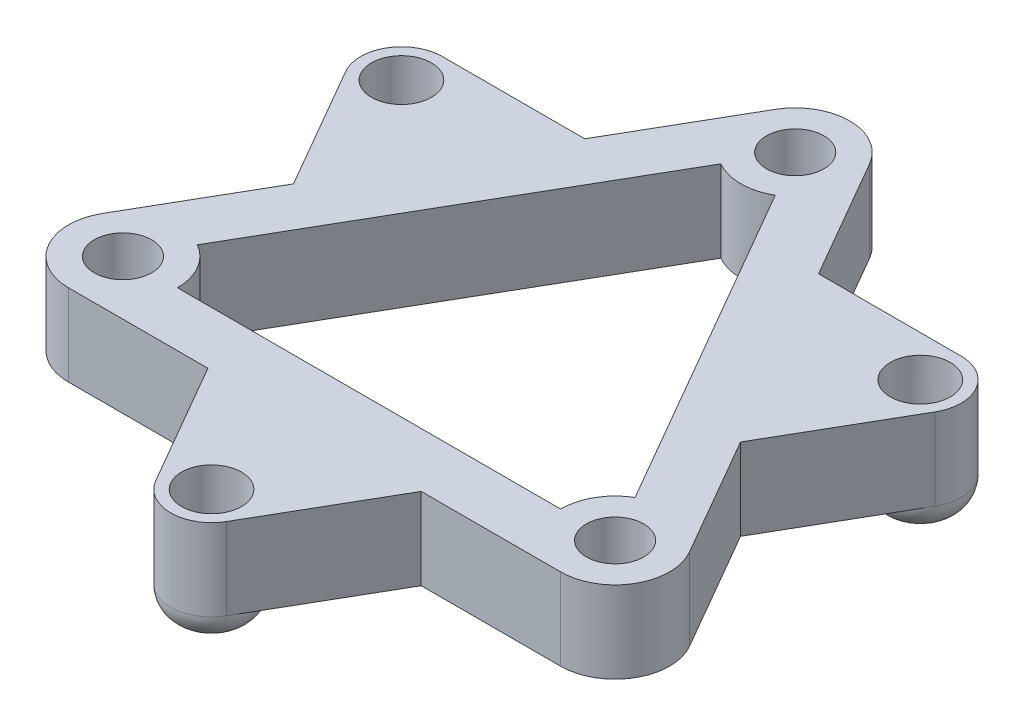
ISO-10303-21;
HEADER;
FILE_DESCRIPTION(('STEP AP214'),'2;1');
FILE_NAME('part.step','',(''),(''),'','','');
FILE_SCHEMA(('AUTOMOTIVE_DESIGN { 1 0 10303 214 1 1 1 1 }'));
ENDSEC;
DATA;
#1=APPLICATION_CONTEXT('core data for automotive mechanical design processes');
#2=APPLICATION_PROTOCOL_DEFINITION('international standard','automotive_design',2000,#1);
#3=PRODUCT_CONTEXT('',#1,'mechanical');
#4=PRODUCT('Part','Part','',(#3));
#5=PRODUCT_RELATED_PRODUCT_CATEGORY('part','',(#4));
#6=PRODUCT_DEFINITION_FORMATION('','',#4);
#7=PRODUCT_DEFINITION_CONTEXT('part definition',#1,'design');
#8=PRODUCT_DEFINITION('design','',#6,#7);
#9=PRODUCT_DEFINITION_SHAPE('','',#8);
#10=(LENGTH_UNIT() NAMED_UNIT(*) SI_UNIT(.MILLI.,.METRE.));
#11=(NAMED_UNIT(*) PLANE_ANGLE_UNIT() SI_UNIT($,.RADIAN.));
#12=(NAMED_UNIT(*) SI_UNIT($,.STERADIAN.) SOLID_ANGLE_UNIT());
#13=UNCERTAINTY_MEASURE_WITH_UNIT(LENGTH_MEASURE(1.E-05),#10,'distance_accuracy_value','');
#14=(GEOMETRIC_REPRESENTATION_CONTEXT(3) GLOBAL_UNCERTAINTY_ASSIGNED_CONTEXT((#13)) GLOBAL_UNIT_ASSIGNED_CONTEXT((#10,
#11,#12)) REPRESENTATION_CONTEXT('',''));
#15=CARTESIAN_POINT('',(0.,0.,0.));
#16=DIRECTION('',(0.,0.,1.));
#17=DIRECTION('',(1.,0.,0.));
#18=AXIS2_PLACEMENT_3D('',#15,#16,#17);
#19=CARTESIAN_POINT('',(9.0358983848623,0.,-2.));
#20=DIRECTION('',(0.,1.,0.));
#21=DIRECTION('',(0.,0.,1.));
#22=AXIS2_PLACEMENT_3D('',#19,#20,#21);
#23=PLANE('',#22);
#24=CARTESIAN_POINT('',(-9.03589838486223,0.,-2.));
#25=DIRECTION('',(0.,1.,0.));
#26=DIRECTION('',(0.,0.,1.));
#27=AXIS2_PLACEMENT_3D('',#24,#25,#26);
#28=CIRCLE('',#27,1.054);
#29=CARTESIAN_POINT('',(-9.03589838486223,0.,-0.945999999999999));
#30=VERTEX_POINT('',#29);
#31=EDGE_CURVE('E403',#30,#30,#28,.T.);
#32=ORIENTED_EDGE('',*,*,#31,.T.);
#33=EDGE_LOOP('',(#32));
#34=FACE_BOUND('',#33,.T.);
#35=CARTESIAN_POINT('',(9.0358983848623,0.,-2.));
#36=DIRECTION('',(0.,1.,0.));
#37=DIRECTION('',(0.,0.,1.));
#38=AXIS2_PLACEMENT_3D('',#35,#36,#37);
#39=CIRCLE('',#38,1.054);
#40=CARTESIAN_POINT('',(9.0358983848623,0.,-0.946));
#41=VERTEX_POINT('',#40);
#42=EDGE_CURVE('E530',#41,#41,#39,.T.);
#43=ORIENTED_EDGE('',*,*,#42,.T.);
#44=EDGE_LOOP('',(#43));
#45=FACE_BOUND('',#44,.T.);
#46=CARTESIAN_POINT('',(1.90824453591173E-13,0.,-17.6506350946111));
#47=DIRECTION('',(0.,1.,0.));
#48=DIRECTION('',(0.,0.,1.));
#49=AXIS2_PLACEMENT_3D('',#46,#47,#48);
#50=CIRCLE('',#49,1.054);
#51=CARTESIAN_POINT('',(1.90824453591173E-13,0.,-16.5966350946111));
#52=VERTEX_POINT('',#51);
#53=EDGE_CURVE('E396',#52,#52,#50,.T.);
#54=ORIENTED_EDGE('',*,*,#53,.T.);
#55=EDGE_LOOP('',(#54));
#56=FACE_BOUND('',#55,.T.);
#57=DIRECTION('',(1.,0.,0.));
#58=VECTOR('',#57,1.);
#59=CARTESIAN_POINT('',(-7.03589838486223,0.,-2.));
#60=LINE('',#59,#58);
#61=CARTESIAN_POINT('',(-7.03589838486223,0.,-2.));
#62=VERTEX_POINT('',#61);
#63=CARTESIAN_POINT('',(7.0358983848623,0.,-2.));
#64=VERTEX_POINT('',#63);
#65=EDGE_CURVE('E544',#62,#64,#60,.T.);
#66=ORIENTED_EDGE('',*,*,#65,.T.);
#67=CARTESIAN_POINT('',(9.0358983848623,0.,-2.));
#68=DIRECTION('',(0.,-1.,0.));
#69=DIRECTION('',(0.,0.,1.));
#70=AXIS2_PLACEMENT_3D('',#67,#68,#69);
#71=CIRCLE('',#70,2.);
#72=CARTESIAN_POINT('',(8.03589838486231,0.,-3.73205080756889));
#73=VERTEX_POINT('',#72);
#74=EDGE_CURVE('E547',#64,#73,#71,.T.);
#75=ORIENTED_EDGE('',*,*,#74,.T.);
#76=DIRECTION('',(-0.499999999999992,0.,-0.866025403784443));
#77=VECTOR('',#76,1.);
#78=CARTESIAN_POINT('',(8.03589838486231,0.,-3.73205080756889));
#79=LINE('',#78,#77);
#80=CARTESIAN_POINT('',(1.00000000000018,0.,-15.9185842870422));
#81=VERTEX_POINT('',#80);
#82=EDGE_CURVE('E590',#73,#81,#79,.T.);
#83=ORIENTED_EDGE('',*,*,#82,.T.);
#84=CARTESIAN_POINT('',(1.90824453591173E-13,0.,-17.6506350946111));
#85=DIRECTION('',(0.,-1.,0.));
#86=DIRECTION('',(0.,0.,1.));
#87=AXIS2_PLACEMENT_3D('',#84,#85,#86);
#88=CIRCLE('',#87,2.);
#89=CARTESIAN_POINT('',(-0.999999999999819,0.,-15.9185842870422));
#90=VERTEX_POINT('',#89);
#91=EDGE_CURVE('E57',#81,#90,#88,.T.);
#92=ORIENTED_EDGE('',*,*,#91,.T.);
#93=DIRECTION('',(-0.500000000000005,0.,0.866025403784436));
#94=VECTOR('',#93,1.);
#95=CARTESIAN_POINT('',(-0.999999999999819,0.,-15.9185842870422));
#96=LINE('',#95,#94);
#97=CARTESIAN_POINT('',(-8.03589838486222,0.,-3.73205080756887));
#98=VERTEX_POINT('',#97);
#99=EDGE_CURVE('E554',#90,#98,#96,.T.);
#100=ORIENTED_EDGE('',*,*,#99,.T.);
#101=CARTESIAN_POINT('',(-9.03589838486223,0.,-2.));
#102=DIRECTION('',(0.,-1.,0.));
#103=DIRECTION('',(0.,0.,1.));
#104=AXIS2_PLACEMENT_3D('',#101,#102,#103);
#105=CIRCLE('',#104,2.);
#106=EDGE_CURVE('E550',#98,#62,#105,.T.);
#107=ORIENTED_EDGE('',*,*,#106,.T.);
#108=EDGE_LOOP('',(#66,#75,#83,#92,#100,#107));
#109=FACE_BOUND('',#108,.T.);
#110=CARTESIAN_POINT('',(-9.52627944162876,0.,-12.7168783648704));
#111=DIRECTION('',(0.,-1.,0.));
#112=DIRECTION('',(0.,0.,-1.));
#113=AXIS2_PLACEMENT_3D('',#110,#111,#112);
#114=CIRCLE('',#113,1.5);
#115=CARTESIAN_POINT('',(-9.52627944162874,0.,-14.2168783648704));
#116=VERTEX_POINT('',#115);
#117=CARTESIAN_POINT('',(-10.8253175473054,0.,-11.9668783648704));
#118=VERTEX_POINT('',#117);
#119=EDGE_CURVE('E220',#116,#118,#114,.T.);
#120=ORIENTED_EDGE('',*,*,#119,.F.);
#121=DIRECTION('',(1.,0.,0.));
#122=VECTOR('',#121,1.);
#123=CARTESIAN_POINT('',(-9.52627944162876,0.,-14.2168783648704));
#124=LINE('',#123,#122);
#125=CARTESIAN_POINT('',(-4.29188144900579,0.,-14.2168783648704));
#126=VERTEX_POINT('',#125);
#127=EDGE_CURVE('E211',#116,#126,#124,.T.);
#128=ORIENTED_EDGE('',*,*,#127,.T.);
#129=DIRECTION('',(-0.500000000000004,0.,0.866025403784436));
#130=VECTOR('',#129,1.);
#131=CARTESIAN_POINT('',(-1.73205080756869,0.,-18.6506350946111));
#132=LINE('',#131,#130);
#133=CARTESIAN_POINT('',(-1.73205080756868,0.,-18.6506350946111));
#134=VERTEX_POINT('',#133);
#135=EDGE_CURVE('E436',#134,#126,#132,.T.);
#136=ORIENTED_EDGE('',*,*,#135,.F.);
#137=CARTESIAN_POINT('',(1.90824453591173E-13,0.,-17.6506350946111));
#138=DIRECTION('',(0.,1.,0.));
#139=DIRECTION('',(0.,0.,1.));
#140=AXIS2_PLACEMENT_3D('',#137,#138,#139);
#141=CIRCLE('',#140,2.00000000000001);
#142=CARTESIAN_POINT('',(1.73205080756907,0.,-18.6506350946111));
#143=VERTEX_POINT('',#142);
#144=EDGE_CURVE('E433',#143,#134,#141,.T.);
#145=ORIENTED_EDGE('',*,*,#144,.F.);
#146=DIRECTION('',(-0.499999999999991,0.,-0.866025403784444));
#147=VECTOR('',#146,1.);
#148=CARTESIAN_POINT('',(10.7679491924312,0.,-2.99999999999998));
#149=LINE('',#148,#147);
#150=CARTESIAN_POINT('',(4.29188144900615,0.,-14.2168783648703));
#151=VERTEX_POINT('',#150);
#152=EDGE_CURVE('E430',#151,#143,#149,.T.);
#153=ORIENTED_EDGE('',*,*,#152,.F.);
#154=CARTESIAN_POINT('',(9.52627944162892,0.,-14.2168783648702));
#155=VERTEX_POINT('',#154);
#156=EDGE_CURVE('E218',#151,#155,#124,.T.);
#157=ORIENTED_EDGE('',*,*,#156,.T.);
#158=CARTESIAN_POINT('',(9.52627944162892,0.,-12.7168783648702));
#159=DIRECTION('',(0.,-1.,0.));
#160=DIRECTION('',(0.,0.,-1.));
#161=AXIS2_PLACEMENT_3D('',#158,#159,#160);
#162=CIRCLE('',#161,1.49999999999992);
#163=CARTESIAN_POINT('',(10.8253175473055,0.,-11.9668783648703));
#164=VERTEX_POINT('',#163);
#165=EDGE_CURVE('E598',#164,#155,#162,.T.);
#166=ORIENTED_EDGE('',*,*,#165,.F.);
#167=DIRECTION('',(-0.500000000000003,0.,0.866025403784437));
#168=VECTOR('',#167,1.);
#169=CARTESIAN_POINT('',(1.29903810567664,0.,4.53312163512964));
#170=LINE('',#169,#168);
#171=CARTESIAN_POINT('',(8.2081185509941,0.,-7.43375672974072));
#172=VERTEX_POINT('',#171);
#173=EDGE_CURVE('E485',#164,#172,#170,.T.);
#174=ORIENTED_EDGE('',*,*,#173,.T.);
#175=CARTESIAN_POINT('',(10.7679491924312,0.,-2.99999999999998));
#176=VERTEX_POINT('',#175);
#177=EDGE_CURVE('E431',#176,#172,#149,.T.);
#178=ORIENTED_EDGE('',*,*,#177,.F.);
#179=CARTESIAN_POINT('',(9.0358983848623,0.,-2.));
#180=DIRECTION('',(0.,1.,0.));
#181=DIRECTION('',(0.,0.,1.));
#182=AXIS2_PLACEMENT_3D('',#179,#180,#181);
#183=CIRCLE('',#182,2.);
#184=CARTESIAN_POINT('',(9.03589838486229,0.,0.));
#185=VERTEX_POINT('',#184);
#186=EDGE_CURVE('E428',#185,#176,#183,.T.);
#187=ORIENTED_EDGE('',*,*,#186,.F.);
#188=DIRECTION('',(1.,0.,0.));
#189=VECTOR('',#188,1.);
#190=CARTESIAN_POINT('',(0.,0.,0.));
#191=LINE('',#190,#189);
#192=CARTESIAN_POINT('',(3.91623710198807,0.,0.));
#193=VERTEX_POINT('',#192);
#194=EDGE_CURVE('E400',#193,#185,#191,.T.);
#195=ORIENTED_EDGE('',*,*,#194,.F.);
#196=CARTESIAN_POINT('',(1.29903810567664,0.,4.53312163512964));
#197=VERTEX_POINT('',#196);
#198=EDGE_CURVE('E206',#193,#197,#170,.T.);
#199=ORIENTED_EDGE('',*,*,#198,.T.);
#200=CARTESIAN_POINT('',(0.,0.,3.78312163512964));
#201=DIRECTION('',(0.,-1.,0.));
#202=DIRECTION('',(0.,0.,-1.));
#203=AXIS2_PLACEMENT_3D('',#200,#201,#202);
#204=CIRCLE('',#203,1.5);
#205=CARTESIAN_POINT('',(-1.29903810567668,0.,4.53312163512963));
#206=VERTEX_POINT('',#205);
#207=EDGE_CURVE('E235',#206,#197,#204,.T.);
#208=ORIENTED_EDGE('',*,*,#207,.F.);
#209=DIRECTION('',(-0.499999999999995,0.,-0.866025403784442));
#210=VECTOR('',#209,1.);
#211=CARTESIAN_POINT('',(-1.29903810567668,0.,4.53312163512963));
#212=LINE('',#211,#210);
#213=CARTESIAN_POINT('',(-3.91623710198805,0.,0.));
#214=VERTEX_POINT('',#213);
#215=EDGE_CURVE('E477',#206,#214,#212,.T.);
#216=ORIENTED_EDGE('',*,*,#215,.T.);
#217=CARTESIAN_POINT('',(-9.03589838486222,0.,0.));
#218=VERTEX_POINT('',#217);
#219=EDGE_CURVE('E426',#218,#214,#191,.T.);
#220=ORIENTED_EDGE('',*,*,#219,.F.);
#221=CARTESIAN_POINT('',(-9.03589838486223,0.,-2.));
#222=DIRECTION('',(0.,1.,0.));
#223=DIRECTION('',(0.,0.,1.));
#224=AXIS2_PLACEMENT_3D('',#221,#222,#223);
#225=CIRCLE('',#224,2.);
#226=CARTESIAN_POINT('',(-10.7679491924311,0.,-3.00000000000001));
#227=VERTEX_POINT('',#226);
#228=EDGE_CURVE('E438',#227,#218,#225,.T.);
#229=ORIENTED_EDGE('',*,*,#228,.F.);
#230=CARTESIAN_POINT('',(-8.20811855099397,0.,-7.43375672974069));
#231=VERTEX_POINT('',#230);
#232=EDGE_CURVE('E435',#231,#227,#132,.T.);
#233=ORIENTED_EDGE('',*,*,#232,.F.);
#234=EDGE_CURVE('E217',#231,#118,#212,.T.);
#235=ORIENTED_EDGE('',*,*,#234,.T.);
#236=EDGE_LOOP('',(#120,#128,#136,#145,#153,#157,#166,#174,#178,#187,#195,#199,#208,#216,#220,
#229,#233,#235));
#237=FACE_BOUND('',#236,.T.);
#238=ADVANCED_FACE('F33',(#34,#45,#56,#109,#237),#23,.F.);
#239=CARTESIAN_POINT('',(0.,3.,0.));
#240=DIRECTION('',(0.,0.,-1.));
#241=DIRECTION('',(-1.,0.,0.));
#242=AXIS2_PLACEMENT_3D('',#239,#240,#241);
#243=PLANE('',#242);
#244=ORIENTED_EDGE('',*,*,#219,.T.);
#245=DIRECTION('',(0.,1.,0.));
#246=VECTOR('',#245,1.);
#247=CARTESIAN_POINT('',(-3.91623710198805,3.,0.));
#248=LINE('',#247,#246);
#249=CARTESIAN_POINT('',(-3.91623710198805,3.,0.));
#250=VERTEX_POINT('',#249);
#251=EDGE_CURVE('E525',#214,#250,#248,.T.);
#252=ORIENTED_EDGE('',*,*,#251,.T.);
#253=DIRECTION('',(1.,0.,0.));
#254=VECTOR('',#253,1.);
#255=CARTESIAN_POINT('',(-9.03589838486222,3.,0.));
#256=LINE('',#255,#254);
#257=CARTESIAN_POINT('',(-9.03589838486222,3.,0.));
#258=VERTEX_POINT('',#257);
#259=EDGE_CURVE('E407',#258,#250,#256,.T.);
#260=ORIENTED_EDGE('',*,*,#259,.F.);
#261=DIRECTION('',(0.,-1.,0.));
#262=VECTOR('',#261,1.);
#263=CARTESIAN_POINT('',(-9.03589838486222,3.,0.));
#264=LINE('',#263,#262);
#265=EDGE_CURVE('E425',#258,#218,#264,.T.);
#266=ORIENTED_EDGE('',*,*,#265,.T.);
#267=EDGE_LOOP('',(#244,#252,#260,#266));
#268=FACE_BOUND('',#267,.T.);
#269=ADVANCED_FACE('F253',(#268),#243,.F.);
#270=CARTESIAN_POINT('',(10.7679491924312,3.,-2.99999999999998));
#271=DIRECTION('',(-0.866025403784444,0.,0.499999999999991));
#272=DIRECTION('',(0.499999999999991,0.,0.866025403784444));
#273=AXIS2_PLACEMENT_3D('',#270,#271,#272);
#274=PLANE('',#273);
#275=ORIENTED_EDGE('',*,*,#177,.T.);
#276=DIRECTION('',(0.,1.,0.));
#277=VECTOR('',#276,1.);
#278=CARTESIAN_POINT('',(8.2081185509941,3.,-7.43375672974073));
#279=LINE('',#278,#277);
#280=CARTESIAN_POINT('',(8.2081185509941,3.,-7.43375672974072));
#281=VERTEX_POINT('',#280);
#282=EDGE_CURVE('E462',#172,#281,#279,.T.);
#283=ORIENTED_EDGE('',*,*,#282,.T.);
#284=DIRECTION('',(-0.499999999999991,0.,-0.866025403784444));
#285=VECTOR('',#284,1.);
#286=CARTESIAN_POINT('',(10.7679491924312,3.,-2.99999999999998));
#287=LINE('',#286,#285);
#288=CARTESIAN_POINT('',(10.7679491924312,3.,-2.99999999999998));
#289=VERTEX_POINT('',#288);
#290=EDGE_CURVE('E414',#289,#281,#287,.T.);
#291=ORIENTED_EDGE('',*,*,#290,.F.);
#292=DIRECTION('',(0.,-1.,0.));
#293=VECTOR('',#292,1.);
#294=CARTESIAN_POINT('',(10.7679491924312,3.,-2.99999999999998));
#295=LINE('',#294,#293);
#296=EDGE_CURVE('E452',#289,#176,#295,.T.);
#297=ORIENTED_EDGE('',*,*,#296,.T.);
#298=EDGE_LOOP('',(#275,#283,#291,#297));
#299=FACE_BOUND('',#298,.T.);
#300=ADVANCED_FACE('F259',(#299),#274,.F.);
#301=CARTESIAN_POINT('',(-1.73205080756869,3.,-18.6506350946111));
#302=DIRECTION('',(0.866025403784436,0.,0.500000000000004));
#303=DIRECTION('',(0.500000000000004,0.,-0.866025403784436));
#304=AXIS2_PLACEMENT_3D('',#301,#302,#303);
#305=PLANE('',#304);
#306=DIRECTION('',(-0.500000000000004,0.,0.866025403784436));
#307=VECTOR('',#306,1.);
#308=CARTESIAN_POINT('',(-1.73205080756869,3.,-18.6506350946111));
#309=LINE('',#308,#307);
#310=CARTESIAN_POINT('',(-8.20811855099397,3.,-7.43375672974069));
#311=VERTEX_POINT('',#310);
#312=CARTESIAN_POINT('',(-10.7679491924311,3.,-3.00000000000001));
#313=VERTEX_POINT('',#312);
#314=EDGE_CURVE('E419',#311,#313,#309,.T.);
#315=ORIENTED_EDGE('',*,*,#314,.F.);
#316=DIRECTION('',(0.,-1.,0.));
#317=VECTOR('',#316,1.);
#318=CARTESIAN_POINT('',(-8.20811855099397,3.,-7.43375672974069));
#319=LINE('',#318,#317);
#320=EDGE_CURVE('E459',#311,#231,#319,.T.);
#321=ORIENTED_EDGE('',*,*,#320,.T.);
#322=ORIENTED_EDGE('',*,*,#232,.T.);
#323=DIRECTION('',(0.,-1.,0.));
#324=VECTOR('',#323,1.);
#325=CARTESIAN_POINT('',(-10.7679491924311,3.,-3.00000000000001));
#326=LINE('',#325,#324);
#327=EDGE_CURVE('E443',#313,#227,#326,.T.);
#328=ORIENTED_EDGE('',*,*,#327,.F.);
#329=EDGE_LOOP('',(#315,#321,#322,#328));
#330=FACE_BOUND('',#329,.T.);
#331=ADVANCED_FACE('F279',(#330),#305,.F.);
#332=CARTESIAN_POINT('',(9.0358983848623,3.,-2.));
#333=DIRECTION('',(0.,1.,0.));
#334=DIRECTION('',(0.,0.,1.));
#335=AXIS2_PLACEMENT_3D('',#332,#333,#334);
#336=PLANE('',#335);
#337=CARTESIAN_POINT('',(9.0358983848623,3.,-2.));
#338=DIRECTION('',(0.,-1.,0.));
#339=DIRECTION('',(0.,0.,1.));
#340=AXIS2_PLACEMENT_3D('',#337,#338,#339);
#341=CIRCLE('',#340,2.);
#342=CARTESIAN_POINT('',(7.0358983848623,3.,-2.));
#343=VERTEX_POINT('',#342);
#344=CARTESIAN_POINT('',(8.03589838486231,3.,-3.73205080756889));
#345=VERTEX_POINT('',#344);
#346=EDGE_CURVE('E49',#343,#345,#341,.T.);
#347=ORIENTED_EDGE('',*,*,#346,.F.);
#348=DIRECTION('',(1.,0.,0.));
#349=VECTOR('',#348,1.);
#350=CARTESIAN_POINT('',(-7.03589838486223,3.,-2.));
#351=LINE('',#350,#349);
#352=CARTESIAN_POINT('',(-7.03589838486223,3.,-2.));
#353=VERTEX_POINT('',#352);
#354=EDGE_CURVE('E571',#353,#343,#351,.T.);
#355=ORIENTED_EDGE('',*,*,#354,.F.);
#356=CARTESIAN_POINT('',(-9.03589838486223,3.,-2.));
#357=DIRECTION('',(0.,-1.,0.));
#358=DIRECTION('',(0.,0.,1.));
#359=AXIS2_PLACEMENT_3D('',#356,#357,#358);
#360=CIRCLE('',#359,2.);
#361=CARTESIAN_POINT('',(-8.03589838486222,3.,-3.73205080756887));
#362=VERTEX_POINT('',#361);
#363=EDGE_CURVE('E568',#362,#353,#360,.T.);
#364=ORIENTED_EDGE('',*,*,#363,.F.);
#365=DIRECTION('',(-0.500000000000005,0.,0.866025403784436));
#366=VECTOR('',#365,1.);
#367=CARTESIAN_POINT('',(-0.999999999999819,3.,-15.9185842870422));
#368=LINE('',#367,#366);
#369=CARTESIAN_POINT('',(-0.999999999999819,3.,-15.9185842870422));
#370=VERTEX_POINT('',#369);
#371=EDGE_CURVE('E565',#370,#362,#368,.T.);
#372=ORIENTED_EDGE('',*,*,#371,.F.);
#373=CARTESIAN_POINT('',(1.90824453591173E-13,3.,-17.6506350946111));
#374=DIRECTION('',(0.,-1.,0.));
#375=DIRECTION('',(0.,0.,1.));
#376=AXIS2_PLACEMENT_3D('',#373,#374,#375);
#377=CIRCLE('',#376,2.);
#378=CARTESIAN_POINT('',(1.00000000000017,3.,-15.9185842870422));
#379=VERTEX_POINT('',#378);
#380=EDGE_CURVE('E562',#379,#370,#377,.T.);
#381=ORIENTED_EDGE('',*,*,#380,.F.);
#382=DIRECTION('',(-0.499999999999992,0.,-0.866025403784443));
#383=VECTOR('',#382,1.);
#384=CARTESIAN_POINT('',(8.03589838486231,3.,-3.73205080756889));
#385=LINE('',#384,#383);
#386=EDGE_CURVE('E559',#345,#379,#385,.T.);
#387=ORIENTED_EDGE('',*,*,#386,.F.);
#388=EDGE_LOOP('',(#347,#355,#364,#372,#381,#387));
#389=FACE_BOUND('',#388,.T.);
#390=CARTESIAN_POINT('',(-1.73205080756868,3.,-18.6506350946111));
#391=VERTEX_POINT('',#390);
#392=CARTESIAN_POINT('',(-4.29188144900579,3.,-14.2168783648704));
#393=VERTEX_POINT('',#392);
#394=EDGE_CURVE('E420',#391,#393,#309,.T.);
#395=ORIENTED_EDGE('',*,*,#394,.T.);
#396=DIRECTION('',(-1.,0.,0.));
#397=VECTOR('',#396,1.);
#398=CARTESIAN_POINT('',(-9.52627944162876,3.,-14.2168783648704));
#399=LINE('',#398,#397);
#400=CARTESIAN_POINT('',(-9.52627944162876,3.,-14.2168783648704));
#401=VERTEX_POINT('',#400);
#402=EDGE_CURVE('E514',#393,#401,#399,.T.);
#403=ORIENTED_EDGE('',*,*,#402,.T.);
#404=CARTESIAN_POINT('',(-9.52627944162876,3.,-12.7168783648704));
#405=DIRECTION('',(0.,1.,0.));
#406=DIRECTION('',(0.,0.,1.));
#407=AXIS2_PLACEMENT_3D('',#404,#405,#406);
#408=CIRCLE('',#407,1.5);
#409=CARTESIAN_POINT('',(-10.8253175473054,3.,-11.9668783648704));
#410=VERTEX_POINT('',#409);
#411=EDGE_CURVE('E203',#401,#410,#408,.T.);
#412=ORIENTED_EDGE('',*,*,#411,.T.);
#413=DIRECTION('',(0.499999999999995,0.,0.866025403784442));
#414=VECTOR('',#413,1.);
#415=CARTESIAN_POINT('',(-1.29903810567668,3.,4.53312163512963));
#416=LINE('',#415,#414);
#417=EDGE_CURVE('E501',#410,#311,#416,.T.);
#418=ORIENTED_EDGE('',*,*,#417,.T.);
#419=ORIENTED_EDGE('',*,*,#314,.T.);
#420=CARTESIAN_POINT('',(-9.03589838486223,3.,-2.));
#421=DIRECTION('',(0.,1.,0.));
#422=DIRECTION('',(0.,0.,1.));
#423=AXIS2_PLACEMENT_3D('',#420,#421,#422);
#424=CIRCLE('',#423,2.);
#425=EDGE_CURVE('E423',#313,#258,#424,.T.);
#426=ORIENTED_EDGE('',*,*,#425,.T.);
#427=ORIENTED_EDGE('',*,*,#259,.T.);
#428=CARTESIAN_POINT('',(-1.29903810567668,3.,4.53312163512963));
#429=VERTEX_POINT('',#428);
#430=EDGE_CURVE('E500',#250,#429,#416,.T.);
#431=ORIENTED_EDGE('',*,*,#430,.T.);
#432=CARTESIAN_POINT('',(0.,3.,3.78312163512964));
#433=DIRECTION('',(0.,1.,0.));
#434=DIRECTION('',(0.,0.,1.));
#435=AXIS2_PLACEMENT_3D('',#432,#433,#434);
#436=CIRCLE('',#435,1.5);
#437=CARTESIAN_POINT('',(1.29903810567664,3.,4.53312163512964));
#438=VERTEX_POINT('',#437);
#439=EDGE_CURVE('E504',#429,#438,#436,.T.);
#440=ORIENTED_EDGE('',*,*,#439,.T.);
#441=DIRECTION('',(0.500000000000003,0.,-0.866025403784437));
#442=VECTOR('',#441,1.);
#443=CARTESIAN_POINT('',(1.29903810567664,3.,4.53312163512964));
#444=LINE('',#443,#442);
#445=CARTESIAN_POINT('',(3.91623710198807,3.,0.));
#446=VERTEX_POINT('',#445);
#447=EDGE_CURVE('E508',#438,#446,#444,.T.);
#448=ORIENTED_EDGE('',*,*,#447,.T.);
#449=CARTESIAN_POINT('',(9.03589838486229,3.,0.));
#450=VERTEX_POINT('',#449);
#451=EDGE_CURVE('E411',#446,#450,#256,.T.);
#452=ORIENTED_EDGE('',*,*,#451,.T.);
#453=CARTESIAN_POINT('',(9.0358983848623,3.,-2.));
#454=DIRECTION('',(0.,1.,0.));
#455=DIRECTION('',(0.,0.,1.));
#456=AXIS2_PLACEMENT_3D('',#453,#454,#455);
#457=CIRCLE('',#456,2.);
#458=EDGE_CURVE('E410',#450,#289,#457,.T.);
#459=ORIENTED_EDGE('',*,*,#458,.T.);
#460=ORIENTED_EDGE('',*,*,#290,.T.);
#461=CARTESIAN_POINT('',(10.8253175473056,3.,-11.9668783648704));
#462=VERTEX_POINT('',#461);
#463=EDGE_CURVE('E507',#281,#462,#444,.T.);
#464=ORIENTED_EDGE('',*,*,#463,.T.);
#465=CARTESIAN_POINT('',(9.52627944162892,3.,-12.7168783648702));
#466=DIRECTION('',(0.,1.,0.));
#467=DIRECTION('',(0.,0.,1.));
#468=AXIS2_PLACEMENT_3D('',#465,#466,#467);
#469=CIRCLE('',#468,1.49999999999995);
#470=CARTESIAN_POINT('',(9.52627944162892,3.,-14.2168783648702));
#471=VERTEX_POINT('',#470);
#472=EDGE_CURVE('E511',#462,#471,#469,.T.);
#473=ORIENTED_EDGE('',*,*,#472,.T.);
#474=CARTESIAN_POINT('',(4.29188144900607,3.,-14.2168783648704));
#475=VERTEX_POINT('',#474);
#476=EDGE_CURVE('E515',#471,#475,#399,.T.);
#477=ORIENTED_EDGE('',*,*,#476,.T.);
#478=CARTESIAN_POINT('',(1.73205080756907,3.,-18.6506350946111));
#479=VERTEX_POINT('',#478);
#480=EDGE_CURVE('E413',#475,#479,#287,.T.);
#481=ORIENTED_EDGE('',*,*,#480,.T.);
#482=CARTESIAN_POINT('',(1.90824453591173E-13,3.,-17.6506350946111));
#483=DIRECTION('',(0.,1.,0.));
#484=DIRECTION('',(0.,0.,1.));
#485=AXIS2_PLACEMENT_3D('',#482,#483,#484);
#486=CIRCLE('',#485,2.00000000000001);
#487=EDGE_CURVE('E417',#479,#391,#486,.T.);
#488=ORIENTED_EDGE('',*,*,#487,.T.);
#489=EDGE_LOOP('',(#395,#403,#412,#418,#419,#426,#427,#431,#440,#448,#452,#459,#460,#464,#473,
#477,#481,#488));
#490=FACE_BOUND('',#489,.T.);
#491=CARTESIAN_POINT('',(1.90824453591173E-13,3.,-17.6506350946111));
#492=DIRECTION('',(0.,1.,0.));
#493=DIRECTION('',(0.,0.,1.));
#494=AXIS2_PLACEMENT_3D('',#491,#492,#493);
#495=CIRCLE('',#494,1.054);
#496=CARTESIAN_POINT('',(1.90824453591173E-13,3.,-16.5966350946111));
#497=VERTEX_POINT('',#496);
#498=EDGE_CURVE('E393',#497,#497,#495,.T.);
#499=ORIENTED_EDGE('',*,*,#498,.F.);
#500=EDGE_LOOP('',(#499));
#501=FACE_BOUND('',#500,.T.);
#502=CARTESIAN_POINT('',(-9.52627944162876,3.,-12.7168783648704));
#503=DIRECTION('',(0.,1.,0.));
#504=DIRECTION('',(0.,0.,1.));
#505=AXIS2_PLACEMENT_3D('',#502,#503,#504);
#506=CIRCLE('',#505,1.1);
#507=CARTESIAN_POINT('',(-9.52627944162876,3.,-11.6168783648704));
#508=VERTEX_POINT('',#507);
#509=EDGE_CURVE('E492',#508,#508,#506,.T.);
#510=ORIENTED_EDGE('',*,*,#509,.F.);
#511=EDGE_LOOP('',(#510));
#512=FACE_BOUND('',#511,.T.);
#513=CARTESIAN_POINT('',(9.52627944162892,3.,-12.7168783648702));
#514=DIRECTION('',(0.,1.,0.));
#515=DIRECTION('',(0.,0.,1.));
#516=AXIS2_PLACEMENT_3D('',#513,#514,#515);
#517=CIRCLE('',#516,1.1);
#518=CARTESIAN_POINT('',(9.52627944162892,3.,-11.6168783648702));
#519=VERTEX_POINT('',#518);
#520=EDGE_CURVE('E489',#519,#519,#517,.T.);
#521=ORIENTED_EDGE('',*,*,#520,.F.);
#522=EDGE_LOOP('',(#521));
#523=FACE_BOUND('',#522,.T.);
#524=CARTESIAN_POINT('',(0.,3.,3.78312163512964));
#525=DIRECTION('',(0.,1.,0.));
#526=DIRECTION('',(0.,0.,1.));
#527=AXIS2_PLACEMENT_3D('',#524,#525,#526);
#528=CIRCLE('',#527,1.1);
#529=CARTESIAN_POINT('',(0.,3.,4.88312163512964));
#530=VERTEX_POINT('',#529);
#531=EDGE_CURVE('E496',#530,#530,#528,.T.);
#532=ORIENTED_EDGE('',*,*,#531,.F.);
#533=EDGE_LOOP('',(#532));
#534=FACE_BOUND('',#533,.T.);
#535=CARTESIAN_POINT('',(9.0358983848623,3.,-2.));
#536=DIRECTION('',(0.,1.,0.));
#537=DIRECTION('',(0.,0.,1.));
#538=AXIS2_PLACEMENT_3D('',#535,#536,#537);
#539=CIRCLE('',#538,1.054);
#540=CARTESIAN_POINT('',(9.0358983848623,3.,-0.946));
#541=VERTEX_POINT('',#540);
#542=EDGE_CURVE('E531',#541,#541,#539,.T.);
#543=ORIENTED_EDGE('',*,*,#542,.F.);
#544=EDGE_LOOP('',(#543));
#545=FACE_BOUND('',#544,.T.);
#546=CARTESIAN_POINT('',(-9.03589838486223,3.,-2.));
#547=DIRECTION('',(0.,1.,0.));
#548=DIRECTION('',(0.,0.,1.));
#549=AXIS2_PLACEMENT_3D('',#546,#547,#548);
#550=CIRCLE('',#549,1.054);
#551=CARTESIAN_POINT('',(-9.03589838486223,3.,-0.945999999999999));
#552=VERTEX_POINT('',#551);
#553=EDGE_CURVE('E398',#552,#552,#550,.T.);
#554=ORIENTED_EDGE('',*,*,#553,.F.);
#555=EDGE_LOOP('',(#554));
#556=FACE_BOUND('',#555,.T.);
#557=ADVANCED_FACE('F267',(#389,#490,#501,#512,#523,#534,#545,#556),#336,.T.);
#558=ORIENTED_EDGE('',*,*,#451,.F.);
#559=DIRECTION('',(0.,-1.,0.));
#560=VECTOR('',#559,1.);
#561=CARTESIAN_POINT('',(3.91623710198807,3.,0.));
#562=LINE('',#561,#560);
#563=EDGE_CURVE('E527',#446,#193,#562,.T.);
#564=ORIENTED_EDGE('',*,*,#563,.T.);
#565=ORIENTED_EDGE('',*,*,#194,.T.);
#566=DIRECTION('',(0.,-1.,0.));
#567=VECTOR('',#566,1.);
#568=CARTESIAN_POINT('',(9.03589838486229,3.,0.));
#569=LINE('',#568,#567);
#570=EDGE_CURVE('E455',#450,#185,#569,.T.);
#571=ORIENTED_EDGE('',*,*,#570,.F.);
#572=EDGE_LOOP('',(#558,#564,#565,#571));
#573=FACE_BOUND('',#572,.T.);
#574=ADVANCED_FACE('F262',(#573),#243,.F.);
#575=CARTESIAN_POINT('',(9.0358983848623,3.,-2.));
#576=DIRECTION('',(0.,-1.,0.));
#577=DIRECTION('',(0.,0.,-1.));
#578=AXIS2_PLACEMENT_3D('',#575,#576,#577);
#579=CYLINDRICAL_SURFACE('',#578,2.);
#580=ORIENTED_EDGE('',*,*,#186,.T.);
#581=ORIENTED_EDGE('',*,*,#296,.F.);
#582=ORIENTED_EDGE('',*,*,#458,.F.);
#583=ORIENTED_EDGE('',*,*,#570,.T.);
#584=EDGE_LOOP('',(#580,#581,#582,#583));
#585=FACE_BOUND('',#584,.T.);
#586=ADVANCED_FACE('F286',(#585),#579,.T.);
#587=ORIENTED_EDGE('',*,*,#480,.F.);
#588=DIRECTION('',(0.,-1.,0.));
#589=VECTOR('',#588,1.);
#590=CARTESIAN_POINT('',(4.29188144900616,3.,-14.2168783648703));
#591=LINE('',#590,#589);
#592=EDGE_CURVE('E480',#475,#151,#591,.T.);
#593=ORIENTED_EDGE('',*,*,#592,.T.);
#594=ORIENTED_EDGE('',*,*,#152,.T.);
#595=DIRECTION('',(0.,-1.,0.));
#596=VECTOR('',#595,1.);
#597=CARTESIAN_POINT('',(1.73205080756907,3.,-18.6506350946111));
#598=LINE('',#597,#596);
#599=EDGE_CURVE('E449',#479,#143,#598,.T.);
#600=ORIENTED_EDGE('',*,*,#599,.F.);
#601=EDGE_LOOP('',(#587,#593,#594,#600));
#602=FACE_BOUND('',#601,.T.);
#603=ADVANCED_FACE('F282',(#602),#274,.F.);
#604=CARTESIAN_POINT('',(1.90824453591173E-13,3.,-17.6506350946111));
#605=DIRECTION('',(0.,-1.,0.));
#606=DIRECTION('',(0.,0.,-1.));
#607=AXIS2_PLACEMENT_3D('',#604,#605,#606);
#608=CYLINDRICAL_SURFACE('',#607,2.00000000000001);
#609=ORIENTED_EDGE('',*,*,#144,.T.);
#610=DIRECTION('',(0.,-1.,0.));
#611=VECTOR('',#610,1.);
#612=CARTESIAN_POINT('',(-1.73205080756868,3.,-18.6506350946111));
#613=LINE('',#612,#611);
#614=EDGE_CURVE('E446',#391,#134,#613,.T.);
#615=ORIENTED_EDGE('',*,*,#614,.F.);
#616=ORIENTED_EDGE('',*,*,#487,.F.);
#617=ORIENTED_EDGE('',*,*,#599,.T.);
#618=EDGE_LOOP('',(#609,#615,#616,#617));
#619=FACE_BOUND('',#618,.T.);
#620=ADVANCED_FACE('F277',(#619),#608,.T.);
#621=ORIENTED_EDGE('',*,*,#135,.T.);
#622=DIRECTION('',(0.,1.,0.));
#623=VECTOR('',#622,1.);
#624=CARTESIAN_POINT('',(-4.29188144900582,3.,-14.2168783648704));
#625=LINE('',#624,#623);
#626=EDGE_CURVE('E214',#126,#393,#625,.T.);
#627=ORIENTED_EDGE('',*,*,#626,.T.);
#628=ORIENTED_EDGE('',*,*,#394,.F.);
#629=ORIENTED_EDGE('',*,*,#614,.T.);
#630=EDGE_LOOP('',(#621,#627,#628,#629));
#631=FACE_BOUND('',#630,.T.);
#632=ADVANCED_FACE('F273',(#631),#305,.F.);
#633=CARTESIAN_POINT('',(-9.03589838486223,3.,-2.));
#634=DIRECTION('',(0.,-1.,0.));
#635=DIRECTION('',(0.,0.,-1.));
#636=AXIS2_PLACEMENT_3D('',#633,#634,#635);
#637=CYLINDRICAL_SURFACE('',#636,2.);
#638=ORIENTED_EDGE('',*,*,#228,.T.);
#639=ORIENTED_EDGE('',*,*,#265,.F.);
#640=ORIENTED_EDGE('',*,*,#425,.F.);
#641=ORIENTED_EDGE('',*,*,#327,.T.);
#642=EDGE_LOOP('',(#638,#639,#640,#641));
#643=FACE_BOUND('',#642,.T.);
#644=ADVANCED_FACE('F269',(#643),#637,.T.);
#645=CARTESIAN_POINT('',(1.90824453591173E-13,3.,-17.6506350946111));
#646=DIRECTION('',(0.,-1.,0.));
#647=DIRECTION('',(0.,0.,-1.));
#648=AXIS2_PLACEMENT_3D('',#645,#646,#647);
#649=CYLINDRICAL_SURFACE('',#648,1.054);
#650=ORIENTED_EDGE('',*,*,#498,.T.);
#651=EDGE_LOOP('',(#650));
#652=FACE_BOUND('',#651,.T.);
#653=ORIENTED_EDGE('',*,*,#53,.F.);
#654=EDGE_LOOP('',(#653));
#655=FACE_BOUND('',#654,.T.);
#656=ADVANCED_FACE('F272',(#652,#655),#649,.F.);
#657=CARTESIAN_POINT('',(-9.03589838486223,3.,-2.));
#658=DIRECTION('',(0.,-1.,0.));
#659=DIRECTION('',(0.,0.,-1.));
#660=AXIS2_PLACEMENT_3D('',#657,#658,#659);
#661=CYLINDRICAL_SURFACE('',#660,1.054);
#662=ORIENTED_EDGE('',*,*,#553,.T.);
#663=EDGE_LOOP('',(#662));
#664=FACE_BOUND('',#663,.T.);
#665=ORIENTED_EDGE('',*,*,#31,.F.);
#666=EDGE_LOOP('',(#665));
#667=FACE_BOUND('',#666,.T.);
#668=ADVANCED_FACE('F382',(#664,#667),#661,.F.);
#669=CARTESIAN_POINT('',(9.0358983848623,3.,-2.));
#670=DIRECTION('',(0.,-1.,0.));
#671=DIRECTION('',(0.,0.,-1.));
#672=AXIS2_PLACEMENT_3D('',#669,#670,#671);
#673=CYLINDRICAL_SURFACE('',#672,1.054);
#674=ORIENTED_EDGE('',*,*,#542,.T.);
#675=EDGE_LOOP('',(#674));
#676=FACE_BOUND('',#675,.T.);
#677=ORIENTED_EDGE('',*,*,#42,.F.);
#678=EDGE_LOOP('',(#677));
#679=FACE_BOUND('',#678,.T.);
#680=ADVANCED_FACE('F379',(#676,#679),#673,.F.);
#681=CARTESIAN_POINT('',(-9.52627944162876,-29.4374821154858,-12.7168783648704));
#682=DIRECTION('',(0.,1.,0.));
#683=DIRECTION('',(0.,0.,1.));
#684=AXIS2_PLACEMENT_3D('',#681,#682,#683);
#685=CYLINDRICAL_SURFACE('',#684,1.5);
#686=DIRECTION('',(0.,1.,0.));
#687=VECTOR('',#686,1.);
#688=CARTESIAN_POINT('',(-9.52627944162876,-29.4374821154858,-14.2168783648704));
#689=LINE('',#688,#687);
#690=EDGE_CURVE('E196',#116,#401,#689,.T.);
#691=ORIENTED_EDGE('',*,*,#690,.F.);
#692=CARTESIAN_POINT('',(-9.52627944162876,0.,-12.7168783648704));
#693=DIRECTION('',(0.,-1.,0.));
#694=DIRECTION('',(0.,0.,-1.));
#695=AXIS2_PLACEMENT_3D('',#692,#693,#694);
#696=CIRCLE('',#695,1.5);
#697=EDGE_CURVE('E200',#116,#118,#696,.F.);
#698=ORIENTED_EDGE('',*,*,#697,.T.);
#699=DIRECTION('',(0.,1.,0.));
#700=VECTOR('',#699,1.);
#701=CARTESIAN_POINT('',(-10.8253175473054,-29.4374821154858,-11.9668783648704));
#702=LINE('',#701,#700);
#703=EDGE_CURVE('E475',#118,#410,#702,.T.);
#704=ORIENTED_EDGE('',*,*,#703,.T.);
#705=ORIENTED_EDGE('',*,*,#411,.F.);
#706=EDGE_LOOP('',(#691,#698,#704,#705));
#707=FACE_BOUND('',#706,.T.);
#708=ADVANCED_FACE('F198',(#707),#685,.T.);
#709=CARTESIAN_POINT('',(-9.52627944162876,-29.4374821154858,-12.7168783648704));
#710=DIRECTION('',(0.,1.,0.));
#711=DIRECTION('',(0.,0.,1.));
#712=AXIS2_PLACEMENT_3D('',#709,#710,#711);
#713=CYLINDRICAL_SURFACE('',#712,1.1);
#714=CARTESIAN_POINT('',(-9.52627944162876,0.,-12.7168783648704));
#715=DIRECTION('',(0.,-1.,0.));
#716=DIRECTION('',(0.,0.,-1.));
#717=AXIS2_PLACEMENT_3D('',#714,#715,#716);
#718=CIRCLE('',#717,1.1);
#719=CARTESIAN_POINT('',(-9.52627944162876,0.,-13.8168783648704));
#720=VERTEX_POINT('',#719);
#721=EDGE_CURVE('E224',#720,#720,#718,.F.);
#722=ORIENTED_EDGE('',*,*,#721,.F.);
#723=EDGE_LOOP('',(#722));
#724=FACE_BOUND('',#723,.T.);
#725=ORIENTED_EDGE('',*,*,#509,.T.);
#726=EDGE_LOOP('',(#725));
#727=FACE_BOUND('',#726,.T.);
#728=ADVANCED_FACE('F350',(#724,#727),#713,.F.);
#729=CARTESIAN_POINT('',(-9.52627944162876,-29.4374821154858,-14.2168783648704));
#730=DIRECTION('',(0.,0.,-1.));
#731=DIRECTION('',(-1.,0.,0.));
#732=AXIS2_PLACEMENT_3D('',#729,#730,#731);
#733=PLANE('',#732);
#734=ORIENTED_EDGE('',*,*,#626,.F.);
#735=ORIENTED_EDGE('',*,*,#127,.F.);
#736=ORIENTED_EDGE('',*,*,#690,.T.);
#737=ORIENTED_EDGE('',*,*,#402,.F.);
#738=EDGE_LOOP('',(#734,#735,#736,#737));
#739=FACE_BOUND('',#738,.T.);
#740=ADVANCED_FACE('F213',(#739),#733,.T.);
#741=CARTESIAN_POINT('',(-1.29903810567668,-29.4374821154858,4.53312163512963));
#742=DIRECTION('',(-0.866025403784441,0.,0.499999999999995));
#743=DIRECTION('',(0.499999999999995,0.,0.866025403784442));
#744=AXIS2_PLACEMENT_3D('',#741,#742,#743);
#745=PLANE('',#744);
#746=ORIENTED_EDGE('',*,*,#320,.F.);
#747=ORIENTED_EDGE('',*,*,#417,.F.);
#748=ORIENTED_EDGE('',*,*,#703,.F.);
#749=ORIENTED_EDGE('',*,*,#234,.F.);
#750=EDGE_LOOP('',(#746,#747,#748,#749));
#751=FACE_BOUND('',#750,.T.);
#752=ADVANCED_FACE('F364',(#751),#745,.T.);
#753=CARTESIAN_POINT('',(9.52627944162892,-29.4374821154858,-12.7168783648702));
#754=DIRECTION('',(0.,1.,0.));
#755=DIRECTION('',(0.,0.,1.));
#756=AXIS2_PLACEMENT_3D('',#753,#754,#755);
#757=CYLINDRICAL_SURFACE('',#756,1.49999999999995);
#758=DIRECTION('',(0.,1.,0.));
#759=VECTOR('',#758,1.);
#760=CARTESIAN_POINT('',(10.8253175473056,-29.4374821154858,-11.9668783648704));
#761=LINE('',#760,#759);
#762=EDGE_CURVE('E519',#164,#462,#761,.T.);
#763=ORIENTED_EDGE('',*,*,#762,.F.);
#764=CARTESIAN_POINT('',(9.52627944162892,0.,-12.7168783648702));
#765=DIRECTION('',(0.,-1.,0.));
#766=DIRECTION('',(0.,0.,-1.));
#767=AXIS2_PLACEMENT_3D('',#764,#765,#766);
#768=CIRCLE('',#767,1.49999999999995);
#769=EDGE_CURVE('E232',#164,#155,#768,.F.);
#770=ORIENTED_EDGE('',*,*,#769,.T.);
#771=DIRECTION('',(0.,1.,0.));
#772=VECTOR('',#771,1.);
#773=CARTESIAN_POINT('',(9.52627944162892,-29.4374821154858,-14.2168783648702));
#774=LINE('',#773,#772);
#775=EDGE_CURVE('E207',#155,#471,#774,.T.);
#776=ORIENTED_EDGE('',*,*,#775,.T.);
#777=ORIENTED_EDGE('',*,*,#472,.F.);
#778=EDGE_LOOP('',(#763,#770,#776,#777));
#779=FACE_BOUND('',#778,.T.);
#780=ADVANCED_FACE('F348',(#779),#757,.T.);
#781=CARTESIAN_POINT('',(9.52627944162892,-29.4374821154858,-12.7168783648702));
#782=DIRECTION('',(0.,1.,0.));
#783=DIRECTION('',(0.,0.,1.));
#784=AXIS2_PLACEMENT_3D('',#781,#782,#783);
#785=CYLINDRICAL_SURFACE('',#784,1.1);
#786=CARTESIAN_POINT('',(9.52627944162892,0.,-12.7168783648702));
#787=DIRECTION('',(0.,-1.,0.));
#788=DIRECTION('',(0.,0.,-1.));
#789=AXIS2_PLACEMENT_3D('',#786,#787,#788);
#790=CIRCLE('',#789,1.1);
#791=CARTESIAN_POINT('',(9.52627944162892,0.,-13.8168783648702));
#792=VERTEX_POINT('',#791);
#793=EDGE_CURVE('E595',#792,#792,#790,.F.);
#794=ORIENTED_EDGE('',*,*,#793,.F.);
#795=EDGE_LOOP('',(#794));
#796=FACE_BOUND('',#795,.T.);
#797=ORIENTED_EDGE('',*,*,#520,.T.);
#798=EDGE_LOOP('',(#797));
#799=FACE_BOUND('',#798,.T.);
#800=ADVANCED_FACE('F344',(#796,#799),#785,.F.);
#801=ORIENTED_EDGE('',*,*,#592,.F.);
#802=ORIENTED_EDGE('',*,*,#476,.F.);
#803=ORIENTED_EDGE('',*,*,#775,.F.);
#804=ORIENTED_EDGE('',*,*,#156,.F.);
#805=EDGE_LOOP('',(#801,#802,#803,#804));
#806=FACE_BOUND('',#805,.T.);
#807=ADVANCED_FACE('F347',(#806),#733,.T.);
#808=CARTESIAN_POINT('',(1.29903810567664,-29.4374821154858,4.53312163512964));
#809=DIRECTION('',(0.866025403784437,0.,0.500000000000003));
#810=DIRECTION('',(0.500000000000003,0.,-0.866025403784437));
#811=AXIS2_PLACEMENT_3D('',#808,#809,#810);
#812=PLANE('',#811);
#813=ORIENTED_EDGE('',*,*,#282,.F.);
#814=ORIENTED_EDGE('',*,*,#173,.F.);
#815=ORIENTED_EDGE('',*,*,#762,.T.);
#816=ORIENTED_EDGE('',*,*,#463,.F.);
#817=EDGE_LOOP('',(#813,#814,#815,#816));
#818=FACE_BOUND('',#817,.T.);
#819=ADVANCED_FACE('F360',(#818),#812,.T.);
#820=ORIENTED_EDGE('',*,*,#563,.F.);
#821=ORIENTED_EDGE('',*,*,#447,.F.);
#822=DIRECTION('',(0.,1.,0.));
#823=VECTOR('',#822,1.);
#824=CARTESIAN_POINT('',(1.29903810567664,-29.4374821154858,4.53312163512964));
#825=LINE('',#824,#823);
#826=EDGE_CURVE('E466',#197,#438,#825,.T.);
#827=ORIENTED_EDGE('',*,*,#826,.F.);
#828=ORIENTED_EDGE('',*,*,#198,.F.);
#829=EDGE_LOOP('',(#820,#821,#827,#828));
#830=FACE_BOUND('',#829,.T.);
#831=ADVANCED_FACE('F366',(#830),#812,.T.);
#832=ORIENTED_EDGE('',*,*,#251,.F.);
#833=ORIENTED_EDGE('',*,*,#215,.F.);
#834=DIRECTION('',(0.,1.,0.));
#835=VECTOR('',#834,1.);
#836=CARTESIAN_POINT('',(-1.29903810567668,-29.4374821154858,4.53312163512963));
#837=LINE('',#836,#835);
#838=EDGE_CURVE('E472',#206,#429,#837,.T.);
#839=ORIENTED_EDGE('',*,*,#838,.T.);
#840=ORIENTED_EDGE('',*,*,#430,.F.);
#841=EDGE_LOOP('',(#832,#833,#839,#840));
#842=FACE_BOUND('',#841,.T.);
#843=ADVANCED_FACE('F369',(#842),#745,.T.);
#844=CARTESIAN_POINT('',(0.,-29.4374821154858,3.78312163512964));
#845=DIRECTION('',(0.,1.,0.));
#846=DIRECTION('',(0.,0.,1.));
#847=AXIS2_PLACEMENT_3D('',#844,#845,#846);
#848=CYLINDRICAL_SURFACE('',#847,1.5);
#849=ORIENTED_EDGE('',*,*,#838,.F.);
#850=CARTESIAN_POINT('',(0.,0.,3.78312163512964));
#851=DIRECTION('',(0.,-1.,0.));
#852=DIRECTION('',(0.,0.,-1.));
#853=AXIS2_PLACEMENT_3D('',#850,#851,#852);
#854=CIRCLE('',#853,1.5);
#855=EDGE_CURVE('E11',#206,#197,#854,.F.);
#856=ORIENTED_EDGE('',*,*,#855,.T.);
#857=ORIENTED_EDGE('',*,*,#826,.T.);
#858=ORIENTED_EDGE('',*,*,#439,.F.);
#859=EDGE_LOOP('',(#849,#856,#857,#858));
#860=FACE_BOUND('',#859,.T.);
#861=ADVANCED_FACE('F356',(#860),#848,.T.);
#862=CARTESIAN_POINT('',(0.,-29.4374821154858,3.78312163512964));
#863=DIRECTION('',(0.,1.,0.));
#864=DIRECTION('',(0.,0.,1.));
#865=AXIS2_PLACEMENT_3D('',#862,#863,#864);
#866=CYLINDRICAL_SURFACE('',#865,1.1);
#867=CARTESIAN_POINT('',(0.,0.,3.78312163512964));
#868=DIRECTION('',(0.,1.,0.));
#869=DIRECTION('',(0.,0.,1.));
#870=AXIS2_PLACEMENT_3D('',#867,#868,#869);
#871=CIRCLE('',#870,1.1);
#872=CARTESIAN_POINT('',(0.,0.,4.88312163512964));
#873=VERTEX_POINT('',#872);
#874=EDGE_CURVE('E483',#873,#873,#871,.F.);
#875=ORIENTED_EDGE('',*,*,#874,.T.);
#876=EDGE_LOOP('',(#875));
#877=FACE_BOUND('',#876,.T.);
#878=ORIENTED_EDGE('',*,*,#531,.T.);
#879=EDGE_LOOP('',(#878));
#880=FACE_BOUND('',#879,.T.);
#881=ADVANCED_FACE('F343',(#877,#880),#866,.F.);
#882=CARTESIAN_POINT('',(9.0358983848623,0.,-2.));
#883=DIRECTION('',(0.,1.,0.));
#884=DIRECTION('',(0.,0.,1.));
#885=AXIS2_PLACEMENT_3D('',#882,#883,#884);
#886=CYLINDRICAL_SURFACE('',#885,2.);
#887=ORIENTED_EDGE('',*,*,#346,.T.);
#888=DIRECTION('',(0.,1.,0.));
#889=VECTOR('',#888,1.);
#890=CARTESIAN_POINT('',(8.03589838486231,0.,-3.73205080756889));
#891=LINE('',#890,#889);
#892=EDGE_CURVE('E551',#73,#345,#891,.T.);
#893=ORIENTED_EDGE('',*,*,#892,.F.);
#894=ORIENTED_EDGE('',*,*,#74,.F.);
#895=DIRECTION('',(0.,1.,0.));
#896=VECTOR('',#895,1.);
#897=CARTESIAN_POINT('',(7.0358983848623,0.,-2.));
#898=LINE('',#897,#896);
#899=EDGE_CURVE('E493',#64,#343,#898,.T.);
#900=ORIENTED_EDGE('',*,*,#899,.T.);
#901=EDGE_LOOP('',(#887,#893,#894,#900));
#902=FACE_BOUND('',#901,.T.);
#903=ADVANCED_FACE('F326',(#902),#886,.T.);
#904=CARTESIAN_POINT('',(-7.03589838486223,0.,-2.));
#905=DIRECTION('',(0.,0.,1.));
#906=DIRECTION('',(1.,0.,0.));
#907=AXIS2_PLACEMENT_3D('',#904,#905,#906);
#908=PLANE('',#907);
#909=ORIENTED_EDGE('',*,*,#354,.T.);
#910=ORIENTED_EDGE('',*,*,#899,.F.);
#911=ORIENTED_EDGE('',*,*,#65,.F.);
#912=DIRECTION('',(0.,1.,0.));
#913=VECTOR('',#912,1.);
#914=CARTESIAN_POINT('',(-7.03589838486223,0.,-2.));
#915=LINE('',#914,#913);
#916=EDGE_CURVE('E575',#62,#353,#915,.T.);
#917=ORIENTED_EDGE('',*,*,#916,.T.);
#918=EDGE_LOOP('',(#909,#910,#911,#917));
#919=FACE_BOUND('',#918,.T.);
#920=ADVANCED_FACE('F322',(#919),#908,.F.);
#921=CARTESIAN_POINT('',(-9.03589838486223,0.,-2.));
#922=DIRECTION('',(0.,1.,0.));
#923=DIRECTION('',(0.,0.,1.));
#924=AXIS2_PLACEMENT_3D('',#921,#922,#923);
#925=CYLINDRICAL_SURFACE('',#924,2.);
#926=ORIENTED_EDGE('',*,*,#363,.T.);
#927=ORIENTED_EDGE('',*,*,#916,.F.);
#928=ORIENTED_EDGE('',*,*,#106,.F.);
#929=DIRECTION('',(0.,1.,0.));
#930=VECTOR('',#929,1.);
#931=CARTESIAN_POINT('',(-8.03589838486222,0.,-3.73205080756887));
#932=LINE('',#931,#930);
#933=EDGE_CURVE('E577',#98,#362,#932,.T.);
#934=ORIENTED_EDGE('',*,*,#933,.T.);
#935=EDGE_LOOP('',(#926,#927,#928,#934));
#936=FACE_BOUND('',#935,.T.);
#937=ADVANCED_FACE('F325',(#936),#925,.T.);
#938=CARTESIAN_POINT('',(-0.999999999999819,0.,-15.9185842870422));
#939=DIRECTION('',(-0.866025403784436,0.,-0.500000000000005));
#940=DIRECTION('',(-0.500000000000005,0.,0.866025403784436));
#941=AXIS2_PLACEMENT_3D('',#938,#939,#940);
#942=PLANE('',#941);
#943=ORIENTED_EDGE('',*,*,#371,.T.);
#944=ORIENTED_EDGE('',*,*,#933,.F.);
#945=ORIENTED_EDGE('',*,*,#99,.F.);
#946=DIRECTION('',(0.,1.,0.));
#947=VECTOR('',#946,1.);
#948=CARTESIAN_POINT('',(-0.999999999999819,0.,-15.9185842870422));
#949=LINE('',#948,#947);
#950=EDGE_CURVE('E579',#90,#370,#949,.T.);
#951=ORIENTED_EDGE('',*,*,#950,.T.);
#952=EDGE_LOOP('',(#943,#944,#945,#951));
#953=FACE_BOUND('',#952,.T.);
#954=ADVANCED_FACE('F330',(#953),#942,.F.);
#955=CARTESIAN_POINT('',(1.90824453591173E-13,0.,-17.6506350946111));
#956=DIRECTION('',(0.,1.,0.));
#957=DIRECTION('',(0.,0.,1.));
#958=AXIS2_PLACEMENT_3D('',#955,#956,#957);
#959=CYLINDRICAL_SURFACE('',#958,2.);
#960=ORIENTED_EDGE('',*,*,#380,.T.);
#961=ORIENTED_EDGE('',*,*,#950,.F.);
#962=ORIENTED_EDGE('',*,*,#91,.F.);
#963=DIRECTION('',(0.,1.,0.));
#964=VECTOR('',#963,1.);
#965=CARTESIAN_POINT('',(1.00000000000017,0.,-15.9185842870422));
#966=LINE('',#965,#964);
#967=EDGE_CURVE('E553',#81,#379,#966,.T.);
#968=ORIENTED_EDGE('',*,*,#967,.T.);
#969=EDGE_LOOP('',(#960,#961,#962,#968));
#970=FACE_BOUND('',#969,.T.);
#971=ADVANCED_FACE('F334',(#970),#959,.T.);
#972=CARTESIAN_POINT('',(8.03589838486231,0.,-3.73205080756889));
#973=DIRECTION('',(0.866025403784443,0.,-0.499999999999992));
#974=DIRECTION('',(-0.499999999999992,0.,-0.866025403784443));
#975=AXIS2_PLACEMENT_3D('',#972,#973,#974);
#976=PLANE('',#975);
#977=ORIENTED_EDGE('',*,*,#386,.T.);
#978=ORIENTED_EDGE('',*,*,#967,.F.);
#979=ORIENTED_EDGE('',*,*,#82,.F.);
#980=ORIENTED_EDGE('',*,*,#892,.T.);
#981=EDGE_LOOP('',(#977,#978,#979,#980));
#982=FACE_BOUND('',#981,.T.);
#983=ADVANCED_FACE('F318',(#982),#976,.F.);
#984=CARTESIAN_POINT('',(0.,-1.,3.78312163512964));
#985=DIRECTION('',(0.,-1.,0.));
#986=DIRECTION('',(0.,0.,-1.));
#987=AXIS2_PLACEMENT_3D('',#984,#985,#986);
#988=PLANE('',#987);
#989=CARTESIAN_POINT('',(0.,-1.,3.78312163512964));
#990=DIRECTION('',(0.,-1.,0.));
#991=DIRECTION('',(0.,0.,-1.));
#992=AXIS2_PLACEMENT_3D('',#989,#990,#991);
#993=CIRCLE('',#992,0.500000000000001);
#994=CARTESIAN_POINT('',(0.,-1.,3.28312163512964));
#995=VERTEX_POINT('',#994);
#996=EDGE_CURVE('E42',#995,#995,#993,.T.);
#997=ORIENTED_EDGE('',*,*,#996,.T.);
#998=EDGE_LOOP('',(#997));
#999=FACE_BOUND('',#998,.T.);
#1000=ADVANCED_FACE('F243',(#999),#988,.T.);
#1001=CARTESIAN_POINT('',(0.,0.,3.78312163512964));
#1002=DIRECTION('',(0.,-1.,0.));
#1003=DIRECTION('',(0.,0.,-1.));
#1004=AXIS2_PLACEMENT_3D('',#1001,#1002,#1003);
#1005=PLANE('',#1004);
#1006=ORIENTED_EDGE('',*,*,#874,.F.);
#1007=EDGE_LOOP('',(#1006));
#1008=FACE_BOUND('',#1007,.T.);
#1009=ADVANCED_FACE('F314',(#1008),#1005,.F.);
#1010=CARTESIAN_POINT('',(9.52627944162892,0.,-12.7168783648702));
#1011=DIRECTION('',(0.,-1.,0.));
#1012=DIRECTION('',(0.,0.,-1.));
#1013=AXIS2_PLACEMENT_3D('',#1010,#1011,#1012);
#1014=PLANE('',#1013);
#1015=ORIENTED_EDGE('',*,*,#793,.T.);
#1016=EDGE_LOOP('',(#1015));
#1017=FACE_BOUND('',#1016,.T.);
#1018=ADVANCED_FACE('F310',(#1017),#1014,.F.);
#1019=CARTESIAN_POINT('',(9.52627944162892,-1.,-12.7168783648702));
#1020=DIRECTION('',(0.,-1.,0.));
#1021=DIRECTION('',(0.,0.,-1.));
#1022=AXIS2_PLACEMENT_3D('',#1019,#1020,#1021);
#1023=PLANE('',#1022);
#1024=CARTESIAN_POINT('',(9.52627944162892,-1.,-12.7168783648702));
#1025=DIRECTION('',(0.,-1.,0.));
#1026=DIRECTION('',(0.,0.,-1.));
#1027=AXIS2_PLACEMENT_3D('',#1024,#1025,#1026);
#1028=CIRCLE('',#1027,0.499999999999948);
#1029=CARTESIAN_POINT('',(9.52627944162892,-1.,-13.2168783648702));
#1030=VERTEX_POINT('',#1029);
#1031=EDGE_CURVE('E228',#1030,#1030,#1028,.T.);
#1032=ORIENTED_EDGE('',*,*,#1031,.T.);
#1033=EDGE_LOOP('',(#1032));
#1034=FACE_BOUND('',#1033,.T.);
#1035=ADVANCED_FACE('F304',(#1034),#1023,.T.);
#1036=CARTESIAN_POINT('',(-9.52627944162876,0.,-12.7168783648704));
#1037=DIRECTION('',(0.,-1.,0.));
#1038=DIRECTION('',(0.,0.,-1.));
#1039=AXIS2_PLACEMENT_3D('',#1036,#1037,#1038);
#1040=PLANE('',#1039);
#1041=ORIENTED_EDGE('',*,*,#721,.T.);
#1042=EDGE_LOOP('',(#1041));
#1043=FACE_BOUND('',#1042,.T.);
#1044=ADVANCED_FACE('F298',(#1043),#1040,.F.);
#1045=CARTESIAN_POINT('',(-9.52627944162876,-1.,-12.7168783648704));
#1046=DIRECTION('',(0.,-1.,0.));
#1047=DIRECTION('',(0.,0.,-1.));
#1048=AXIS2_PLACEMENT_3D('',#1045,#1046,#1047);
#1049=PLANE('',#1048);
#1050=CARTESIAN_POINT('',(-9.52627944162876,-1.,-12.7168783648704));
#1051=DIRECTION('',(0.,-1.,0.));
#1052=DIRECTION('',(0.,0.,-1.));
#1053=AXIS2_PLACEMENT_3D('',#1050,#1051,#1052);
#1054=CIRCLE('',#1053,0.500000000000002);
#1055=CARTESIAN_POINT('',(-9.52627944162876,-1.,-13.2168783648704));
#1056=VERTEX_POINT('',#1055);
#1057=EDGE_CURVE('E229',#1056,#1056,#1054,.T.);
#1058=ORIENTED_EDGE('',*,*,#1057,.T.);
#1059=EDGE_LOOP('',(#1058));
#1060=FACE_BOUND('',#1059,.T.);
#1061=ADVANCED_FACE('F294',(#1060),#1049,.T.);
#1062=CARTESIAN_POINT('',(-9.52627944162876,0.,-12.7168783648704));
#1063=DIRECTION('',(0.,-1.,0.));
#1064=DIRECTION('',(0.,0.,-1.));
#1065=AXIS2_PLACEMENT_3D('',#1062,#1063,#1064);
#1066=DEGENERATE_TOROIDAL_SURFACE('',#1065,0.500000000000002,1.,.T.);
#1067=ORIENTED_EDGE('',*,*,#119,.T.);
#1068=ORIENTED_EDGE('',*,*,#697,.F.);
#1069=EDGE_LOOP('',(#1067,#1068));
#1070=FACE_BOUND('',#1069,.T.);
#1071=ORIENTED_EDGE('',*,*,#1057,.F.);
#1072=EDGE_LOOP('',(#1071));
#1073=FACE_BOUND('',#1072,.T.);
#1074=ADVANCED_FACE('F226',(#1070,#1073),#1066,.T.);
#1075=CARTESIAN_POINT('',(9.52627944162892,0.,-12.7168783648702));
#1076=DIRECTION('',(0.,-1.,0.));
#1077=DIRECTION('',(0.,0.,-1.));
#1078=AXIS2_PLACEMENT_3D('',#1075,#1076,#1077);
#1079=DEGENERATE_TOROIDAL_SURFACE('',#1078,0.499999999999948,1.,.T.);
#1080=ORIENTED_EDGE('',*,*,#769,.F.);
#1081=ORIENTED_EDGE('',*,*,#165,.T.);
#1082=EDGE_LOOP('',(#1080,#1081));
#1083=FACE_BOUND('',#1082,.T.);
#1084=ORIENTED_EDGE('',*,*,#1031,.F.);
#1085=EDGE_LOOP('',(#1084));
#1086=FACE_BOUND('',#1085,.T.);
#1087=ADVANCED_FACE('F246',(#1083,#1086),#1079,.T.);
#1088=CARTESIAN_POINT('',(0.,0.,3.78312163512964));
#1089=DIRECTION('',(0.,-1.,0.));
#1090=DIRECTION('',(0.,0.,-1.));
#1091=AXIS2_PLACEMENT_3D('',#1088,#1089,#1090);
#1092=DEGENERATE_TOROIDAL_SURFACE('',#1091,0.500000000000001,1.,.T.);
#1093=ORIENTED_EDGE('',*,*,#207,.T.);
#1094=ORIENTED_EDGE('',*,*,#855,.F.);
#1095=EDGE_LOOP('',(#1093,#1094));
#1096=FACE_BOUND('',#1095,.T.);
#1097=ORIENTED_EDGE('',*,*,#996,.F.);
#1098=EDGE_LOOP('',(#1097));
#1099=FACE_BOUND('',#1098,.T.);
#1100=ADVANCED_FACE('F35',(#1096,#1099),#1092,.T.);
#1101=CLOSED_SHELL('',(#238,#269,#300,#331,#557,#574,#586,#603,#620,#632,#644,#656,#668,#680,
#708,#728,#740,#752,#780,#800,#807,#819,#831,#843,#861,#881,#903,#920,#937,#954,#971,#983,#1000,
#1009,#1018,#1035,#1044,#1061,#1074,#1087,#1100));
#1102=MANIFOLD_SOLID_BREP('B2',#1101);
#1103=ADVANCED_BREP_SHAPE_REPRESENTATION('',(#18,#1102),#14);
#1104=SHAPE_DEFINITION_REPRESENTATION(#9,#1103);
ENDSEC;
END-ISO-10303-21;
